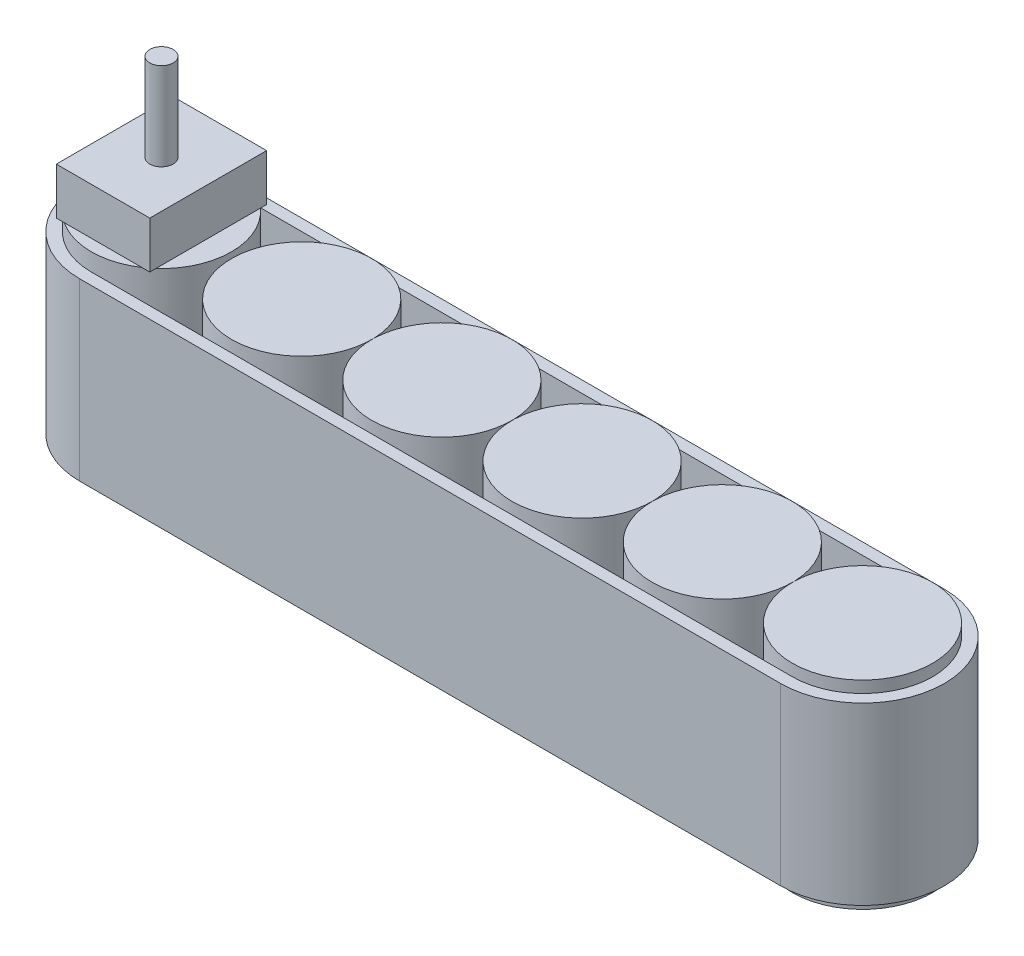
ISO-10303-21;
HEADER;
FILE_DESCRIPTION(('STEP AP214'),'2;1');
FILE_NAME('part.step','',(''),(''),'','','');
FILE_SCHEMA(('AUTOMOTIVE_DESIGN { 1 0 10303 214 1 1 1 1 }'));
ENDSEC;
DATA;
#1=APPLICATION_CONTEXT('core data for automotive mechanical design processes');
#2=APPLICATION_PROTOCOL_DEFINITION('international standard','automotive_design',2000,#1);
#3=PRODUCT_CONTEXT('',#1,'mechanical');
#4=PRODUCT('Part','Part','',(#3));
#5=PRODUCT_RELATED_PRODUCT_CATEGORY('part','',(#4));
#6=PRODUCT_DEFINITION_FORMATION('','',#4);
#7=PRODUCT_DEFINITION_CONTEXT('part definition',#1,'design');
#8=PRODUCT_DEFINITION('design','',#6,#7);
#9=PRODUCT_DEFINITION_SHAPE('','',#8);
#10=(LENGTH_UNIT() NAMED_UNIT(*) SI_UNIT(.MILLI.,.METRE.));
#11=(NAMED_UNIT(*) PLANE_ANGLE_UNIT() SI_UNIT($,.RADIAN.));
#12=(NAMED_UNIT(*) SI_UNIT($,.STERADIAN.) SOLID_ANGLE_UNIT());
#13=UNCERTAINTY_MEASURE_WITH_UNIT(LENGTH_MEASURE(1.E-05),#10,'distance_accuracy_value','');
#14=(GEOMETRIC_REPRESENTATION_CONTEXT(3) GLOBAL_UNCERTAINTY_ASSIGNED_CONTEXT((#13)) GLOBAL_UNIT_ASSIGNED_CONTEXT((#10,
#11,#12)) REPRESENTATION_CONTEXT('',''));
#15=CARTESIAN_POINT('',(0.,0.,0.));
#16=DIRECTION('',(0.,0.,1.));
#17=DIRECTION('',(1.,0.,0.));
#18=AXIS2_PLACEMENT_3D('',#15,#16,#17);
#19=CARTESIAN_POINT('',(480.,85.,0.));
#20=DIRECTION('',(0.,-1.,0.));
#21=DIRECTION('',(0.,0.,-1.));
#22=AXIS2_PLACEMENT_3D('',#19,#20,#21);
#23=CYLINDRICAL_SURFACE('',#22,60.0000000000001);
#24=CARTESIAN_POINT('',(480.,85.,0.));
#25=DIRECTION('',(0.,1.,0.));
#26=DIRECTION('',(0.,0.,1.));
#27=AXIS2_PLACEMENT_3D('',#24,#25,#26);
#28=CIRCLE('',#27,60.0000000000001);
#29=CARTESIAN_POINT('',(480.,85.,60.0000000000001));
#30=VERTEX_POINT('',#29);
#31=EDGE_CURVE('E12',#30,#30,#28,.T.);
#32=ORIENTED_EDGE('',*,*,#31,.F.);
#33=EDGE_LOOP('',(#32));
#34=FACE_BOUND('',#33,.T.);
#35=CARTESIAN_POINT('',(480.,-85.,0.));
#36=DIRECTION('',(0.,1.,0.));
#37=DIRECTION('',(0.,0.,1.));
#38=AXIS2_PLACEMENT_3D('',#35,#36,#37);
#39=CIRCLE('',#38,60.0000000000001);
#40=CARTESIAN_POINT('',(480.,-85.,60.0000000000001));
#41=VERTEX_POINT('',#40);
#42=EDGE_CURVE('E74',#41,#41,#39,.T.);
#43=ORIENTED_EDGE('',*,*,#42,.T.);
#44=EDGE_LOOP('',(#43));
#45=FACE_BOUND('',#44,.T.);
#46=ADVANCED_FACE('F71',(#34,#45),#23,.T.);
#47=CARTESIAN_POINT('',(0.,85.,0.));
#48=DIRECTION('',(0.,1.,0.));
#49=DIRECTION('',(0.,0.,1.));
#50=AXIS2_PLACEMENT_3D('',#47,#48,#49);
#51=PLANE('',#50);
#52=ORIENTED_EDGE('',*,*,#31,.T.);
#53=EDGE_LOOP('',(#52));
#54=FACE_BOUND('',#53,.T.);
#55=ADVANCED_FACE('F86',(#54),#51,.T.);
#56=CARTESIAN_POINT('',(0.,-85.,0.));
#57=DIRECTION('',(0.,1.,0.));
#58=DIRECTION('',(0.,0.,1.));
#59=AXIS2_PLACEMENT_3D('',#56,#57,#58);
#60=PLANE('',#59);
#61=ORIENTED_EDGE('',*,*,#42,.F.);
#62=EDGE_LOOP('',(#61));
#63=FACE_BOUND('',#62,.T.);
#64=ADVANCED_FACE('F84',(#63),#60,.F.);
#65=CLOSED_SHELL('',(#46,#55,#64));
#66=MANIFOLD_SOLID_BREP('B2',#65);
#67=CARTESIAN_POINT('',(360.,85.,0.));
#68=DIRECTION('',(0.,-1.,0.));
#69=DIRECTION('',(0.,0.,-1.));
#70=AXIS2_PLACEMENT_3D('',#67,#68,#69);
#71=CYLINDRICAL_SURFACE('',#70,60.);
#72=CARTESIAN_POINT('',(360.,85.,0.));
#73=DIRECTION('',(0.,1.,0.));
#74=DIRECTION('',(0.,0.,1.));
#75=AXIS2_PLACEMENT_3D('',#72,#73,#74);
#76=CIRCLE('',#75,60.);
#77=CARTESIAN_POINT('',(360.,85.,60.));
#78=VERTEX_POINT('',#77);
#79=EDGE_CURVE('E70',#78,#78,#76,.T.);
#80=ORIENTED_EDGE('',*,*,#79,.F.);
#81=EDGE_LOOP('',(#80));
#82=FACE_BOUND('',#81,.T.);
#83=CARTESIAN_POINT('',(360.,-85.,0.));
#84=DIRECTION('',(0.,1.,0.));
#85=DIRECTION('',(0.,0.,1.));
#86=AXIS2_PLACEMENT_3D('',#83,#84,#85);
#87=CIRCLE('',#86,60.);
#88=CARTESIAN_POINT('',(360.,-85.,60.));
#89=VERTEX_POINT('',#88);
#90=EDGE_CURVE('E122',#89,#89,#87,.T.);
#91=ORIENTED_EDGE('',*,*,#90,.T.);
#92=EDGE_LOOP('',(#91));
#93=FACE_BOUND('',#92,.T.);
#94=ADVANCED_FACE('F119',(#82,#93),#71,.T.);
#95=CARTESIAN_POINT('',(0.,85.,0.));
#96=DIRECTION('',(0.,1.,0.));
#97=DIRECTION('',(0.,0.,1.));
#98=AXIS2_PLACEMENT_3D('',#95,#96,#97);
#99=PLANE('',#98);
#100=ORIENTED_EDGE('',*,*,#79,.T.);
#101=EDGE_LOOP('',(#100));
#102=FACE_BOUND('',#101,.T.);
#103=ADVANCED_FACE('F134',(#102),#99,.T.);
#104=CARTESIAN_POINT('',(0.,-85.,0.));
#105=DIRECTION('',(0.,1.,0.));
#106=DIRECTION('',(0.,0.,1.));
#107=AXIS2_PLACEMENT_3D('',#104,#105,#106);
#108=PLANE('',#107);
#109=ORIENTED_EDGE('',*,*,#90,.F.);
#110=EDGE_LOOP('',(#109));
#111=FACE_BOUND('',#110,.T.);
#112=ADVANCED_FACE('F132',(#111),#108,.F.);
#113=CLOSED_SHELL('',(#94,#103,#112));
#114=MANIFOLD_SOLID_BREP('B7',#113);
#115=CARTESIAN_POINT('',(240.,85.,0.));
#116=DIRECTION('',(0.,-1.,0.));
#117=DIRECTION('',(0.,0.,-1.));
#118=AXIS2_PLACEMENT_3D('',#115,#116,#117);
#119=CYLINDRICAL_SURFACE('',#118,60.);
#120=CARTESIAN_POINT('',(240.,85.,0.));
#121=DIRECTION('',(0.,1.,0.));
#122=DIRECTION('',(0.,0.,1.));
#123=AXIS2_PLACEMENT_3D('',#120,#121,#122);
#124=CIRCLE('',#123,60.);
#125=CARTESIAN_POINT('',(240.,85.,60.));
#126=VERTEX_POINT('',#125);
#127=EDGE_CURVE('E118',#126,#126,#124,.T.);
#128=ORIENTED_EDGE('',*,*,#127,.F.);
#129=EDGE_LOOP('',(#128));
#130=FACE_BOUND('',#129,.T.);
#131=CARTESIAN_POINT('',(240.,-85.,0.));
#132=DIRECTION('',(0.,1.,0.));
#133=DIRECTION('',(0.,0.,1.));
#134=AXIS2_PLACEMENT_3D('',#131,#132,#133);
#135=CIRCLE('',#134,60.);
#136=CARTESIAN_POINT('',(240.,-85.,60.));
#137=VERTEX_POINT('',#136);
#138=EDGE_CURVE('E170',#137,#137,#135,.T.);
#139=ORIENTED_EDGE('',*,*,#138,.T.);
#140=EDGE_LOOP('',(#139));
#141=FACE_BOUND('',#140,.T.);
#142=ADVANCED_FACE('F167',(#130,#141),#119,.T.);
#143=CARTESIAN_POINT('',(0.,85.,0.));
#144=DIRECTION('',(0.,1.,0.));
#145=DIRECTION('',(0.,0.,1.));
#146=AXIS2_PLACEMENT_3D('',#143,#144,#145);
#147=PLANE('',#146);
#148=ORIENTED_EDGE('',*,*,#127,.T.);
#149=EDGE_LOOP('',(#148));
#150=FACE_BOUND('',#149,.T.);
#151=ADVANCED_FACE('F182',(#150),#147,.T.);
#152=CARTESIAN_POINT('',(0.,-85.,0.));
#153=DIRECTION('',(0.,1.,0.));
#154=DIRECTION('',(0.,0.,1.));
#155=AXIS2_PLACEMENT_3D('',#152,#153,#154);
#156=PLANE('',#155);
#157=ORIENTED_EDGE('',*,*,#138,.F.);
#158=EDGE_LOOP('',(#157));
#159=FACE_BOUND('',#158,.T.);
#160=ADVANCED_FACE('F180',(#159),#156,.F.);
#161=CLOSED_SHELL('',(#142,#151,#160));
#162=MANIFOLD_SOLID_BREP('B65',#161);
#163=CARTESIAN_POINT('',(120.,85.,0.));
#164=DIRECTION('',(0.,-1.,0.));
#165=DIRECTION('',(0.,0.,-1.));
#166=AXIS2_PLACEMENT_3D('',#163,#164,#165);
#167=CYLINDRICAL_SURFACE('',#166,60.);
#168=CARTESIAN_POINT('',(120.,85.,0.));
#169=DIRECTION('',(0.,1.,0.));
#170=DIRECTION('',(0.,0.,1.));
#171=AXIS2_PLACEMENT_3D('',#168,#169,#170);
#172=CIRCLE('',#171,60.);
#173=CARTESIAN_POINT('',(120.,85.,60.));
#174=VERTEX_POINT('',#173);
#175=EDGE_CURVE('E166',#174,#174,#172,.T.);
#176=ORIENTED_EDGE('',*,*,#175,.F.);
#177=EDGE_LOOP('',(#176));
#178=FACE_BOUND('',#177,.T.);
#179=CARTESIAN_POINT('',(120.,-85.,0.));
#180=DIRECTION('',(0.,1.,0.));
#181=DIRECTION('',(0.,0.,1.));
#182=AXIS2_PLACEMENT_3D('',#179,#180,#181);
#183=CIRCLE('',#182,60.);
#184=CARTESIAN_POINT('',(120.,-85.,60.));
#185=VERTEX_POINT('',#184);
#186=EDGE_CURVE('E219',#185,#185,#183,.T.);
#187=ORIENTED_EDGE('',*,*,#186,.T.);
#188=EDGE_LOOP('',(#187));
#189=FACE_BOUND('',#188,.T.);
#190=ADVANCED_FACE('F216',(#178,#189),#167,.T.);
#191=CARTESIAN_POINT('',(0.,85.,0.));
#192=DIRECTION('',(0.,1.,0.));
#193=DIRECTION('',(0.,0.,1.));
#194=AXIS2_PLACEMENT_3D('',#191,#192,#193);
#195=PLANE('',#194);
#196=ORIENTED_EDGE('',*,*,#175,.T.);
#197=EDGE_LOOP('',(#196));
#198=FACE_BOUND('',#197,.T.);
#199=ADVANCED_FACE('F231',(#198),#195,.T.);
#200=CARTESIAN_POINT('',(0.,-85.,0.));
#201=DIRECTION('',(0.,1.,0.));
#202=DIRECTION('',(0.,0.,1.));
#203=AXIS2_PLACEMENT_3D('',#200,#201,#202);
#204=PLANE('',#203);
#205=ORIENTED_EDGE('',*,*,#186,.F.);
#206=EDGE_LOOP('',(#205));
#207=FACE_BOUND('',#206,.T.);
#208=ADVANCED_FACE('F229',(#207),#204,.F.);
#209=CLOSED_SHELL('',(#190,#199,#208));
#210=MANIFOLD_SOLID_BREP('B113',#209);
#211=CARTESIAN_POINT('',(0.,90.,0.));
#212=DIRECTION('',(0.,1.,0.));
#213=DIRECTION('',(0.,0.,1.));
#214=AXIS2_PLACEMENT_3D('',#211,#212,#213);
#215=PLANE('',#214);
#216=CARTESIAN_POINT('',(0.,90.,0.));
#217=DIRECTION('',(0.,1.,0.));
#218=DIRECTION('',(0.,0.,1.));
#219=AXIS2_PLACEMENT_3D('',#216,#217,#218);
#220=CIRCLE('',#219,60.);
#221=CARTESIAN_POINT('',(40.,90.,44.7213595499958));
#222=VERTEX_POINT('',#221);
#223=CARTESIAN_POINT('',(40.,90.,-44.7213595499958));
#224=VERTEX_POINT('',#223);
#225=EDGE_CURVE('E413',#222,#224,#220,.T.);
#226=ORIENTED_EDGE('',*,*,#225,.T.);
#227=DIRECTION('',(0.,0.,-1.));
#228=VECTOR('',#227,1.);
#229=CARTESIAN_POINT('',(40.,90.,-50.));
#230=LINE('',#229,#228);
#231=EDGE_CURVE('E566',#222,#224,#230,.T.);
#232=ORIENTED_EDGE('',*,*,#231,.F.);
#233=EDGE_LOOP('',(#226,#232));
#234=FACE_BOUND('',#233,.T.);
#235=ADVANCED_FACE('F257',(#234),#215,.T.);
#236=CARTESIAN_POINT('',(33.166247903554,90.,-50.));
#237=VERTEX_POINT('',#236);
#238=CARTESIAN_POINT('',(-33.166247903554,90.,-50.));
#239=VERTEX_POINT('',#238);
#240=EDGE_CURVE('E593',#237,#239,#220,.T.);
#241=ORIENTED_EDGE('',*,*,#240,.T.);
#242=DIRECTION('',(-1.,0.,0.));
#243=VECTOR('',#242,1.);
#244=CARTESIAN_POINT('',(-40.,90.,-50.));
#245=LINE('',#244,#243);
#246=EDGE_CURVE('E577',#237,#239,#245,.T.);
#247=ORIENTED_EDGE('',*,*,#246,.F.);
#248=EDGE_LOOP('',(#241,#247));
#249=FACE_BOUND('',#248,.T.);
#250=ADVANCED_FACE('F532',(#249),#215,.T.);
#251=CARTESIAN_POINT('',(-40.,90.,-44.7213595499958));
#252=VERTEX_POINT('',#251);
#253=CARTESIAN_POINT('',(-40.,90.,44.7213595499958));
#254=VERTEX_POINT('',#253);
#255=EDGE_CURVE('E557',#252,#254,#220,.T.);
#256=ORIENTED_EDGE('',*,*,#255,.T.);
#257=DIRECTION('',(0.,0.,1.));
#258=VECTOR('',#257,1.);
#259=CARTESIAN_POINT('',(-40.,90.,-50.));
#260=LINE('',#259,#258);
#261=EDGE_CURVE('E581',#252,#254,#260,.T.);
#262=ORIENTED_EDGE('',*,*,#261,.F.);
#263=EDGE_LOOP('',(#256,#262));
#264=FACE_BOUND('',#263,.T.);
#265=ADVANCED_FACE('F539',(#264),#215,.T.);
#266=CARTESIAN_POINT('',(-33.166247903554,90.,50.));
#267=VERTEX_POINT('',#266);
#268=CARTESIAN_POINT('',(33.166247903554,90.,50.));
#269=VERTEX_POINT('',#268);
#270=EDGE_CURVE('E414',#267,#269,#220,.T.);
#271=ORIENTED_EDGE('',*,*,#270,.T.);
#272=DIRECTION('',(1.,0.,0.));
#273=VECTOR('',#272,1.);
#274=CARTESIAN_POINT('',(-40.,90.,50.));
#275=LINE('',#274,#273);
#276=EDGE_CURVE('E555',#267,#269,#275,.T.);
#277=ORIENTED_EDGE('',*,*,#276,.F.);
#278=EDGE_LOOP('',(#271,#277));
#279=FACE_BOUND('',#278,.T.);
#280=ADVANCED_FACE('F506',(#279),#215,.T.);
#281=CARTESIAN_POINT('',(0.,75.,0.));
#282=DIRECTION('',(0.,1.,0.));
#283=DIRECTION('',(0.,0.,1.));
#284=AXIS2_PLACEMENT_3D('',#281,#282,#283);
#285=PLANE('',#284);
#286=CARTESIAN_POINT('',(0.,75.,0.));
#287=DIRECTION('',(0.,1.,0.));
#288=DIRECTION('',(0.,0.,1.));
#289=AXIS2_PLACEMENT_3D('',#286,#287,#288);
#290=CIRCLE('',#289,70.);
#291=CARTESIAN_POINT('',(0.,75.,-70.));
#292=VERTEX_POINT('',#291);
#293=CARTESIAN_POINT('',(0.,75.,70.));
#294=VERTEX_POINT('',#293);
#295=EDGE_CURVE('E457',#292,#294,#290,.T.);
#296=ORIENTED_EDGE('',*,*,#295,.T.);
#297=DIRECTION('',(1.,0.,0.));
#298=VECTOR('',#297,1.);
#299=CARTESIAN_POINT('',(0.,75.,70.));
#300=LINE('',#299,#298);
#301=CARTESIAN_POINT('',(600.,75.,70.));
#302=VERTEX_POINT('',#301);
#303=EDGE_CURVE('E460',#294,#302,#300,.T.);
#304=ORIENTED_EDGE('',*,*,#303,.T.);
#305=CARTESIAN_POINT('',(600.,75.,0.));
#306=DIRECTION('',(0.,1.,0.));
#307=DIRECTION('',(0.,0.,1.));
#308=AXIS2_PLACEMENT_3D('',#305,#306,#307);
#309=CIRCLE('',#308,70.);
#310=CARTESIAN_POINT('',(600.,75.,-70.));
#311=VERTEX_POINT('',#310);
#312=EDGE_CURVE('E463',#302,#311,#309,.T.);
#313=ORIENTED_EDGE('',*,*,#312,.T.);
#314=DIRECTION('',(-1.,0.,0.));
#315=VECTOR('',#314,1.);
#316=CARTESIAN_POINT('',(0.,75.,-70.));
#317=LINE('',#316,#315);
#318=EDGE_CURVE('E465',#311,#292,#317,.T.);
#319=ORIENTED_EDGE('',*,*,#318,.T.);
#320=EDGE_LOOP('',(#296,#304,#313,#319));
#321=FACE_BOUND('',#320,.T.);
#322=DIRECTION('',(1.,0.,0.));
#323=VECTOR('',#322,1.);
#324=CARTESIAN_POINT('',(0.,75.,60.));
#325=LINE('',#324,#323);
#326=CARTESIAN_POINT('',(0.,75.,60.));
#327=VERTEX_POINT('',#326);
#328=CARTESIAN_POINT('',(600.,75.,60.));
#329=VERTEX_POINT('',#328);
#330=EDGE_CURVE('E432',#327,#329,#325,.T.);
#331=ORIENTED_EDGE('',*,*,#330,.F.);
#332=CARTESIAN_POINT('',(0.,75.,0.));
#333=DIRECTION('',(0.,1.,0.));
#334=DIRECTION('',(0.,0.,1.));
#335=AXIS2_PLACEMENT_3D('',#332,#333,#334);
#336=CIRCLE('',#335,60.);
#337=CARTESIAN_POINT('',(0.,75.,-60.));
#338=VERTEX_POINT('',#337);
#339=EDGE_CURVE('E430',#338,#327,#336,.T.);
#340=ORIENTED_EDGE('',*,*,#339,.F.);
#341=DIRECTION('',(-1.,0.,0.));
#342=VECTOR('',#341,1.);
#343=CARTESIAN_POINT('',(0.,75.,-60.));
#344=LINE('',#343,#342);
#345=CARTESIAN_POINT('',(600.,75.,-60.));
#346=VERTEX_POINT('',#345);
#347=EDGE_CURVE('E438',#346,#338,#344,.T.);
#348=ORIENTED_EDGE('',*,*,#347,.F.);
#349=CARTESIAN_POINT('',(600.,75.,0.));
#350=DIRECTION('',(0.,1.,0.));
#351=DIRECTION('',(0.,0.,1.));
#352=AXIS2_PLACEMENT_3D('',#349,#350,#351);
#353=CIRCLE('',#352,60.);
#354=EDGE_CURVE('E435',#329,#346,#353,.T.);
#355=ORIENTED_EDGE('',*,*,#354,.F.);
#356=EDGE_LOOP('',(#331,#340,#348,#355));
#357=FACE_BOUND('',#356,.T.);
#358=ADVANCED_FACE('F503',(#321,#357),#285,.T.);
#359=CARTESIAN_POINT('',(0.,-75.,0.));
#360=DIRECTION('',(0.,1.,0.));
#361=DIRECTION('',(0.,0.,1.));
#362=AXIS2_PLACEMENT_3D('',#359,#360,#361);
#363=PLANE('',#362);
#364=CARTESIAN_POINT('',(0.,-75.,0.));
#365=DIRECTION('',(0.,1.,0.));
#366=DIRECTION('',(0.,0.,1.));
#367=AXIS2_PLACEMENT_3D('',#364,#365,#366);
#368=CIRCLE('',#367,70.);
#369=CARTESIAN_POINT('',(0.,-75.,-70.));
#370=VERTEX_POINT('',#369);
#371=CARTESIAN_POINT('',(0.,-75.,70.));
#372=VERTEX_POINT('',#371);
#373=EDGE_CURVE('E456',#370,#372,#368,.T.);
#374=ORIENTED_EDGE('',*,*,#373,.F.);
#375=DIRECTION('',(-1.,0.,0.));
#376=VECTOR('',#375,1.);
#377=CARTESIAN_POINT('',(0.,-75.,-70.));
#378=LINE('',#377,#376);
#379=CARTESIAN_POINT('',(600.,-75.,-70.));
#380=VERTEX_POINT('',#379);
#381=EDGE_CURVE('E461',#380,#370,#378,.T.);
#382=ORIENTED_EDGE('',*,*,#381,.F.);
#383=CARTESIAN_POINT('',(600.,-75.,0.));
#384=DIRECTION('',(0.,1.,0.));
#385=DIRECTION('',(0.,0.,1.));
#386=AXIS2_PLACEMENT_3D('',#383,#384,#385);
#387=CIRCLE('',#386,70.);
#388=CARTESIAN_POINT('',(600.,-75.,70.));
#389=VERTEX_POINT('',#388);
#390=EDGE_CURVE('E472',#389,#380,#387,.T.);
#391=ORIENTED_EDGE('',*,*,#390,.F.);
#392=DIRECTION('',(1.,0.,0.));
#393=VECTOR('',#392,1.);
#394=CARTESIAN_POINT('',(0.,-75.,70.));
#395=LINE('',#394,#393);
#396=EDGE_CURVE('E470',#372,#389,#395,.T.);
#397=ORIENTED_EDGE('',*,*,#396,.F.);
#398=EDGE_LOOP('',(#374,#382,#391,#397));
#399=FACE_BOUND('',#398,.T.);
#400=CARTESIAN_POINT('',(0.,-75.,0.));
#401=DIRECTION('',(0.,1.,0.));
#402=DIRECTION('',(0.,0.,1.));
#403=AXIS2_PLACEMENT_3D('',#400,#401,#402);
#404=CIRCLE('',#403,60.);
#405=CARTESIAN_POINT('',(0.,-75.,-60.));
#406=VERTEX_POINT('',#405);
#407=CARTESIAN_POINT('',(0.,-75.,60.));
#408=VERTEX_POINT('',#407);
#409=EDGE_CURVE('E429',#406,#408,#404,.T.);
#410=ORIENTED_EDGE('',*,*,#409,.T.);
#411=DIRECTION('',(1.,0.,0.));
#412=VECTOR('',#411,1.);
#413=CARTESIAN_POINT('',(0.,-75.,60.));
#414=LINE('',#413,#412);
#415=CARTESIAN_POINT('',(600.,-75.,60.));
#416=VERTEX_POINT('',#415);
#417=EDGE_CURVE('E443',#408,#416,#414,.T.);
#418=ORIENTED_EDGE('',*,*,#417,.T.);
#419=CARTESIAN_POINT('',(600.,-75.,0.));
#420=DIRECTION('',(0.,1.,0.));
#421=DIRECTION('',(0.,0.,1.));
#422=AXIS2_PLACEMENT_3D('',#419,#420,#421);
#423=CIRCLE('',#422,60.);
#424=CARTESIAN_POINT('',(600.,-75.,-60.0000000000001));
#425=VERTEX_POINT('',#424);
#426=EDGE_CURVE('E445',#416,#425,#423,.T.);
#427=ORIENTED_EDGE('',*,*,#426,.T.);
#428=DIRECTION('',(-1.,0.,0.));
#429=VECTOR('',#428,1.);
#430=CARTESIAN_POINT('',(0.,-75.,-60.));
#431=LINE('',#430,#429);
#432=EDGE_CURVE('E433',#425,#406,#431,.T.);
#433=ORIENTED_EDGE('',*,*,#432,.T.);
#434=EDGE_LOOP('',(#410,#418,#427,#433));
#435=FACE_BOUND('',#434,.T.);
#436=ADVANCED_FACE('F495',(#399,#435),#363,.F.);
#437=CARTESIAN_POINT('',(0.,75.,0.));
#438=DIRECTION('',(0.,-1.,0.));
#439=DIRECTION('',(0.,0.,-1.));
#440=AXIS2_PLACEMENT_3D('',#437,#438,#439);
#441=CYLINDRICAL_SURFACE('',#440,70.);
#442=ORIENTED_EDGE('',*,*,#373,.T.);
#443=DIRECTION('',(0.,-1.,0.));
#444=VECTOR('',#443,1.);
#445=CARTESIAN_POINT('',(0.,75.,70.));
#446=LINE('',#445,#444);
#447=EDGE_CURVE('E261',#294,#372,#446,.T.);
#448=ORIENTED_EDGE('',*,*,#447,.F.);
#449=ORIENTED_EDGE('',*,*,#295,.F.);
#450=DIRECTION('',(0.,-1.,0.));
#451=VECTOR('',#450,1.);
#452=CARTESIAN_POINT('',(0.,75.,-70.));
#453=LINE('',#452,#451);
#454=EDGE_CURVE('E467',#292,#370,#453,.T.);
#455=ORIENTED_EDGE('',*,*,#454,.T.);
#456=EDGE_LOOP('',(#442,#448,#449,#455));
#457=FACE_BOUND('',#456,.T.);
#458=ADVANCED_FACE('F259',(#457),#441,.T.);
#459=CARTESIAN_POINT('',(0.,75.,70.));
#460=DIRECTION('',(0.,0.,-1.));
#461=DIRECTION('',(-1.,0.,0.));
#462=AXIS2_PLACEMENT_3D('',#459,#460,#461);
#463=PLANE('',#462);
#464=ORIENTED_EDGE('',*,*,#396,.T.);
#465=DIRECTION('',(0.,-1.,0.));
#466=VECTOR('',#465,1.);
#467=CARTESIAN_POINT('',(600.,75.,70.));
#468=LINE('',#467,#466);
#469=EDGE_CURVE('E479',#302,#389,#468,.T.);
#470=ORIENTED_EDGE('',*,*,#469,.F.);
#471=ORIENTED_EDGE('',*,*,#303,.F.);
#472=ORIENTED_EDGE('',*,*,#447,.T.);
#473=EDGE_LOOP('',(#464,#470,#471,#472));
#474=FACE_BOUND('',#473,.T.);
#475=ADVANCED_FACE('F488',(#474),#463,.F.);
#476=CARTESIAN_POINT('',(600.,75.,0.));
#477=DIRECTION('',(0.,-1.,0.));
#478=DIRECTION('',(0.,0.,-1.));
#479=AXIS2_PLACEMENT_3D('',#476,#477,#478);
#480=CYLINDRICAL_SURFACE('',#479,70.);
#481=ORIENTED_EDGE('',*,*,#390,.T.);
#482=DIRECTION('',(0.,-1.,0.));
#483=VECTOR('',#482,1.);
#484=CARTESIAN_POINT('',(600.,75.,-70.));
#485=LINE('',#484,#483);
#486=EDGE_CURVE('E477',#311,#380,#485,.T.);
#487=ORIENTED_EDGE('',*,*,#486,.F.);
#488=ORIENTED_EDGE('',*,*,#312,.F.);
#489=ORIENTED_EDGE('',*,*,#469,.T.);
#490=EDGE_LOOP('',(#481,#487,#488,#489));
#491=FACE_BOUND('',#490,.T.);
#492=ADVANCED_FACE('F498',(#491),#480,.T.);
#493=CARTESIAN_POINT('',(0.,75.,-70.));
#494=DIRECTION('',(0.,0.,1.));
#495=DIRECTION('',(1.,0.,0.));
#496=AXIS2_PLACEMENT_3D('',#493,#494,#495);
#497=PLANE('',#496);
#498=ORIENTED_EDGE('',*,*,#381,.T.);
#499=ORIENTED_EDGE('',*,*,#454,.F.);
#500=ORIENTED_EDGE('',*,*,#318,.F.);
#501=ORIENTED_EDGE('',*,*,#486,.T.);
#502=EDGE_LOOP('',(#498,#499,#500,#501));
#503=FACE_BOUND('',#502,.T.);
#504=ADVANCED_FACE('F501',(#503),#497,.F.);
#505=CARTESIAN_POINT('',(0.,75.,60.));
#506=DIRECTION('',(0.,0.,-1.));
#507=DIRECTION('',(-1.,0.,0.));
#508=AXIS2_PLACEMENT_3D('',#505,#506,#507);
#509=PLANE('',#508);
#510=ORIENTED_EDGE('',*,*,#330,.T.);
#511=DIRECTION('',(0.,-1.,0.));
#512=VECTOR('',#511,1.);
#513=CARTESIAN_POINT('',(600.,75.,60.));
#514=LINE('',#513,#512);
#515=EDGE_CURVE('E451',#329,#416,#514,.T.);
#516=ORIENTED_EDGE('',*,*,#515,.T.);
#517=ORIENTED_EDGE('',*,*,#417,.F.);
#518=DIRECTION('',(0.,-1.,0.));
#519=VECTOR('',#518,1.);
#520=CARTESIAN_POINT('',(0.,75.,60.));
#521=LINE('',#520,#519);
#522=EDGE_CURVE('E454',#327,#408,#521,.T.);
#523=ORIENTED_EDGE('',*,*,#522,.F.);
#524=EDGE_LOOP('',(#510,#516,#517,#523));
#525=FACE_BOUND('',#524,.T.);
#526=ADVANCED_FACE('F514',(#525),#509,.T.);
#527=CARTESIAN_POINT('',(0.,75.,-60.));
#528=DIRECTION('',(0.,0.,1.));
#529=DIRECTION('',(1.,0.,0.));
#530=AXIS2_PLACEMENT_3D('',#527,#528,#529);
#531=PLANE('',#530);
#532=ORIENTED_EDGE('',*,*,#347,.T.);
#533=DIRECTION('',(0.,-1.,0.));
#534=VECTOR('',#533,1.);
#535=CARTESIAN_POINT('',(0.,75.,-60.));
#536=LINE('',#535,#534);
#537=EDGE_CURVE('E440',#338,#406,#536,.T.);
#538=ORIENTED_EDGE('',*,*,#537,.T.);
#539=ORIENTED_EDGE('',*,*,#432,.F.);
#540=DIRECTION('',(0.,-1.,0.));
#541=VECTOR('',#540,1.);
#542=CARTESIAN_POINT('',(600.,75.,-60.));
#543=LINE('',#542,#541);
#544=EDGE_CURVE('E281',#346,#425,#543,.T.);
#545=ORIENTED_EDGE('',*,*,#544,.F.);
#546=EDGE_LOOP('',(#532,#538,#539,#545));
#547=FACE_BOUND('',#546,.T.);
#548=ADVANCED_FACE('F522',(#547),#531,.T.);
#549=CARTESIAN_POINT('',(0.,85.,0.));
#550=DIRECTION('',(0.,-1.,0.));
#551=DIRECTION('',(0.,0.,-1.));
#552=AXIS2_PLACEMENT_3D('',#549,#550,#551);
#553=CYLINDRICAL_SURFACE('',#552,60.);
#554=CARTESIAN_POINT('',(0.,-85.,0.));
#555=DIRECTION('',(0.,1.,0.));
#556=DIRECTION('',(0.,0.,1.));
#557=AXIS2_PLACEMENT_3D('',#554,#555,#556);
#558=CIRCLE('',#557,60.);
#559=CARTESIAN_POINT('',(0.,-85.,60.));
#560=VERTEX_POINT('',#559);
#561=EDGE_CURVE('E424',#560,#560,#558,.T.);
#562=ORIENTED_EDGE('',*,*,#561,.T.);
#563=EDGE_LOOP('',(#562));
#564=FACE_BOUND('',#563,.T.);
#565=ORIENTED_EDGE('',*,*,#522,.T.);
#566=ORIENTED_EDGE('',*,*,#409,.F.);
#567=ORIENTED_EDGE('',*,*,#537,.F.);
#568=ORIENTED_EDGE('',*,*,#339,.T.);
#569=EDGE_LOOP('',(#565,#566,#567,#568));
#570=FACE_BOUND('',#569,.T.);
#571=EDGE_CURVE('E410',#269,#222,#220,.T.);
#572=ORIENTED_EDGE('',*,*,#571,.F.);
#573=ORIENTED_EDGE('',*,*,#270,.F.);
#574=CARTESIAN_POINT('',(0.,90.,0.));
#575=DIRECTION('',(0.,1.,0.));
#576=DIRECTION('',(0.,0.,1.));
#577=AXIS2_PLACEMENT_3D('',#574,#575,#576);
#578=CIRCLE('',#577,60.);
#579=EDGE_CURVE('E401',#254,#267,#578,.T.);
#580=ORIENTED_EDGE('',*,*,#579,.F.);
#581=ORIENTED_EDGE('',*,*,#255,.F.);
#582=EDGE_CURVE('E403',#239,#252,#578,.T.);
#583=ORIENTED_EDGE('',*,*,#582,.F.);
#584=ORIENTED_EDGE('',*,*,#240,.F.);
#585=EDGE_CURVE('E405',#224,#237,#578,.T.);
#586=ORIENTED_EDGE('',*,*,#585,.F.);
#587=ORIENTED_EDGE('',*,*,#225,.F.);
#588=EDGE_LOOP('',(#572,#573,#580,#581,#583,#584,#586,#587));
#589=FACE_BOUND('',#588,.T.);
#590=ADVANCED_FACE('F519',(#564,#570,#589),#553,.T.);
#591=CARTESIAN_POINT('',(0.,-85.,0.));
#592=DIRECTION('',(0.,1.,0.));
#593=DIRECTION('',(0.,0.,1.));
#594=AXIS2_PLACEMENT_3D('',#591,#592,#593);
#595=PLANE('',#594);
#596=CARTESIAN_POINT('',(0.,-85.,0.));
#597=DIRECTION('',(0.,-1.,0.));
#598=DIRECTION('',(0.,0.,-1.));
#599=AXIS2_PLACEMENT_3D('',#596,#597,#598);
#600=CIRCLE('',#599,12.5);
#601=CARTESIAN_POINT('',(0.,-85.,-12.5));
#602=VERTEX_POINT('',#601);
#603=EDGE_CURVE('E214',#602,#602,#600,.T.);
#604=ORIENTED_EDGE('',*,*,#603,.F.);
#605=EDGE_LOOP('',(#604));
#606=FACE_BOUND('',#605,.T.);
#607=ORIENTED_EDGE('',*,*,#561,.F.);
#608=EDGE_LOOP('',(#607));
#609=FACE_BOUND('',#608,.T.);
#610=ADVANCED_FACE('F654',(#606,#609),#595,.F.);
#611=CARTESIAN_POINT('',(600.,85.,0.));
#612=DIRECTION('',(0.,-1.,0.));
#613=DIRECTION('',(0.,0.,-1.));
#614=AXIS2_PLACEMENT_3D('',#611,#612,#613);
#615=CYLINDRICAL_SURFACE('',#614,60.0000000000001);
#616=CARTESIAN_POINT('',(600.,-85.,0.));
#617=DIRECTION('',(0.,1.,0.));
#618=DIRECTION('',(0.,0.,1.));
#619=AXIS2_PLACEMENT_3D('',#616,#617,#618);
#620=CIRCLE('',#619,60.0000000000001);
#621=CARTESIAN_POINT('',(600.,-85.,60.0000000000001));
#622=VERTEX_POINT('',#621);
#623=EDGE_CURVE('E419',#622,#622,#620,.T.);
#624=ORIENTED_EDGE('',*,*,#623,.T.);
#625=EDGE_LOOP('',(#624));
#626=FACE_BOUND('',#625,.T.);
#627=CARTESIAN_POINT('',(600.,85.,0.));
#628=DIRECTION('',(0.,1.,0.));
#629=DIRECTION('',(0.,0.,1.));
#630=AXIS2_PLACEMENT_3D('',#627,#628,#629);
#631=CIRCLE('',#630,60.0000000000001);
#632=CARTESIAN_POINT('',(600.,85.,60.0000000000001));
#633=VERTEX_POINT('',#632);
#634=EDGE_CURVE('E421',#633,#633,#631,.T.);
#635=ORIENTED_EDGE('',*,*,#634,.F.);
#636=EDGE_LOOP('',(#635));
#637=FACE_BOUND('',#636,.T.);
#638=ORIENTED_EDGE('',*,*,#426,.F.);
#639=ORIENTED_EDGE('',*,*,#515,.F.);
#640=ORIENTED_EDGE('',*,*,#354,.T.);
#641=ORIENTED_EDGE('',*,*,#544,.T.);
#642=EDGE_LOOP('',(#638,#639,#640,#641));
#643=FACE_BOUND('',#642,.T.);
#644=ADVANCED_FACE('F524',(#626,#637,#643),#615,.T.);
#645=CARTESIAN_POINT('',(0.,85.,0.));
#646=DIRECTION('',(0.,1.,0.));
#647=DIRECTION('',(0.,0.,1.));
#648=AXIS2_PLACEMENT_3D('',#645,#646,#647);
#649=PLANE('',#648);
#650=ORIENTED_EDGE('',*,*,#634,.T.);
#651=EDGE_LOOP('',(#650));
#652=FACE_BOUND('',#651,.T.);
#653=ADVANCED_FACE('F724',(#652),#649,.T.);
#654=CARTESIAN_POINT('',(0.,-85.,0.));
#655=DIRECTION('',(0.,1.,0.));
#656=DIRECTION('',(0.,0.,1.));
#657=AXIS2_PLACEMENT_3D('',#654,#655,#656);
#658=PLANE('',#657);
#659=ORIENTED_EDGE('',*,*,#623,.F.);
#660=EDGE_LOOP('',(#659));
#661=FACE_BOUND('',#660,.T.);
#662=ADVANCED_FACE('F705',(#661),#658,.F.);
#663=CARTESIAN_POINT('',(0.,-125.,0.));
#664=DIRECTION('',(0.,1.,0.));
#665=DIRECTION('',(0.,0.,1.));
#666=AXIS2_PLACEMENT_3D('',#663,#664,#665);
#667=CYLINDRICAL_SURFACE('',#666,12.5);
#668=CARTESIAN_POINT('',(0.,-125.,0.));
#669=DIRECTION('',(0.,-1.,0.));
#670=DIRECTION('',(0.,0.,-1.));
#671=AXIS2_PLACEMENT_3D('',#668,#669,#670);
#672=CIRCLE('',#671,12.5);
#673=CARTESIAN_POINT('',(0.,-125.,-12.5));
#674=VERTEX_POINT('',#673);
#675=EDGE_CURVE('E417',#674,#674,#672,.T.);
#676=ORIENTED_EDGE('',*,*,#675,.F.);
#677=EDGE_LOOP('',(#676));
#678=FACE_BOUND('',#677,.T.);
#679=ORIENTED_EDGE('',*,*,#603,.T.);
#680=EDGE_LOOP('',(#679));
#681=FACE_BOUND('',#680,.T.);
#682=ADVANCED_FACE('F695',(#678,#681),#667,.T.);
#683=CARTESIAN_POINT('',(0.,-125.,0.));
#684=DIRECTION('',(0.,-1.,0.));
#685=DIRECTION('',(0.,0.,-1.));
#686=AXIS2_PLACEMENT_3D('',#683,#684,#685);
#687=PLANE('',#686);
#688=ORIENTED_EDGE('',*,*,#675,.T.);
#689=EDGE_LOOP('',(#688));
#690=FACE_BOUND('',#689,.T.);
#691=ADVANCED_FACE('F613',(#690),#687,.T.);
#692=CARTESIAN_POINT('',(0.,90.,0.));
#693=DIRECTION('',(0.,1.,0.));
#694=DIRECTION('',(0.,0.,1.));
#695=AXIS2_PLACEMENT_3D('',#692,#693,#694);
#696=PLANE('',#695);
#697=CARTESIAN_POINT('',(40.,90.,50.));
#698=VERTEX_POINT('',#697);
#699=EDGE_CURVE('E564',#269,#698,#275,.T.);
#700=ORIENTED_EDGE('',*,*,#699,.F.);
#701=ORIENTED_EDGE('',*,*,#571,.T.);
#702=EDGE_CURVE('E563',#698,#222,#230,.T.);
#703=ORIENTED_EDGE('',*,*,#702,.F.);
#704=EDGE_LOOP('',(#700,#701,#703));
#705=FACE_BOUND('',#704,.T.);
#706=ADVANCED_FACE('F562',(#705),#696,.F.);
#707=CARTESIAN_POINT('',(40.,90.,-50.));
#708=VERTEX_POINT('',#707);
#709=EDGE_CURVE('E399',#224,#708,#230,.T.);
#710=ORIENTED_EDGE('',*,*,#709,.F.);
#711=ORIENTED_EDGE('',*,*,#585,.T.);
#712=EDGE_CURVE('E574',#708,#237,#245,.T.);
#713=ORIENTED_EDGE('',*,*,#712,.F.);
#714=EDGE_LOOP('',(#710,#711,#713));
#715=FACE_BOUND('',#714,.T.);
#716=ADVANCED_FACE('F601',(#715),#696,.F.);
#717=CARTESIAN_POINT('',(-40.,90.,-50.));
#718=VERTEX_POINT('',#717);
#719=EDGE_CURVE('E568',#239,#718,#245,.T.);
#720=ORIENTED_EDGE('',*,*,#719,.F.);
#721=ORIENTED_EDGE('',*,*,#582,.T.);
#722=EDGE_CURVE('E578',#718,#252,#260,.T.);
#723=ORIENTED_EDGE('',*,*,#722,.F.);
#724=EDGE_LOOP('',(#720,#721,#723));
#725=FACE_BOUND('',#724,.T.);
#726=ADVANCED_FACE('F603',(#725),#696,.F.);
#727=CARTESIAN_POINT('',(-40.,90.,50.));
#728=VERTEX_POINT('',#727);
#729=EDGE_CURVE('E576',#254,#728,#260,.T.);
#730=ORIENTED_EDGE('',*,*,#729,.F.);
#731=ORIENTED_EDGE('',*,*,#579,.T.);
#732=EDGE_CURVE('E273',#728,#267,#275,.T.);
#733=ORIENTED_EDGE('',*,*,#732,.F.);
#734=EDGE_LOOP('',(#730,#731,#733));
#735=FACE_BOUND('',#734,.T.);
#736=ADVANCED_FACE('F587',(#735),#696,.F.);
#737=CARTESIAN_POINT('',(0.,130.,0.));
#738=DIRECTION('',(0.,1.,0.));
#739=DIRECTION('',(0.,0.,1.));
#740=AXIS2_PLACEMENT_3D('',#737,#738,#739);
#741=PLANE('',#740);
#742=DIRECTION('',(0.,0.,-1.));
#743=VECTOR('',#742,1.);
#744=CARTESIAN_POINT('',(40.,130.,-50.));
#745=LINE('',#744,#743);
#746=CARTESIAN_POINT('',(40.,130.,50.));
#747=VERTEX_POINT('',#746);
#748=CARTESIAN_POINT('',(40.,130.,-50.));
#749=VERTEX_POINT('',#748);
#750=EDGE_CURVE('E385',#747,#749,#745,.T.);
#751=ORIENTED_EDGE('',*,*,#750,.T.);
#752=DIRECTION('',(-1.,0.,0.));
#753=VECTOR('',#752,1.);
#754=CARTESIAN_POINT('',(-40.,130.,-50.));
#755=LINE('',#754,#753);
#756=CARTESIAN_POINT('',(-40.,130.,-50.));
#757=VERTEX_POINT('',#756);
#758=EDGE_CURVE('E374',#749,#757,#755,.T.);
#759=ORIENTED_EDGE('',*,*,#758,.T.);
#760=DIRECTION('',(0.,0.,1.));
#761=VECTOR('',#760,1.);
#762=CARTESIAN_POINT('',(-40.,130.,-50.));
#763=LINE('',#762,#761);
#764=CARTESIAN_POINT('',(-40.,130.,50.));
#765=VERTEX_POINT('',#764);
#766=EDGE_CURVE('E384',#757,#765,#763,.T.);
#767=ORIENTED_EDGE('',*,*,#766,.T.);
#768=DIRECTION('',(1.,0.,0.));
#769=VECTOR('',#768,1.);
#770=CARTESIAN_POINT('',(-40.,130.,50.));
#771=LINE('',#770,#769);
#772=EDGE_CURVE('E391',#765,#747,#771,.T.);
#773=ORIENTED_EDGE('',*,*,#772,.T.);
#774=EDGE_LOOP('',(#751,#759,#767,#773));
#775=FACE_BOUND('',#774,.T.);
#776=CARTESIAN_POINT('',(0.,130.,0.));
#777=DIRECTION('',(0.,1.,0.));
#778=DIRECTION('',(0.,0.,1.));
#779=AXIS2_PLACEMENT_3D('',#776,#777,#778);
#780=CIRCLE('',#779,10.);
#781=CARTESIAN_POINT('',(0.,130.,10.));
#782=VERTEX_POINT('',#781);
#783=EDGE_CURVE('E570',#782,#782,#780,.T.);
#784=ORIENTED_EDGE('',*,*,#783,.F.);
#785=EDGE_LOOP('',(#784));
#786=FACE_BOUND('',#785,.T.);
#787=ADVANCED_FACE('F388',(#775,#786),#741,.T.);
#788=CARTESIAN_POINT('',(40.,130.,-50.));
#789=DIRECTION('',(-1.,0.,0.));
#790=DIRECTION('',(0.,0.,1.));
#791=AXIS2_PLACEMENT_3D('',#788,#789,#790);
#792=PLANE('',#791);
#793=ORIENTED_EDGE('',*,*,#702,.T.);
#794=ORIENTED_EDGE('',*,*,#231,.T.);
#795=ORIENTED_EDGE('',*,*,#709,.T.);
#796=DIRECTION('',(0.,-1.,0.));
#797=VECTOR('',#796,1.);
#798=CARTESIAN_POINT('',(40.,130.,-50.));
#799=LINE('',#798,#797);
#800=EDGE_CURVE('E379',#749,#708,#799,.T.);
#801=ORIENTED_EDGE('',*,*,#800,.F.);
#802=ORIENTED_EDGE('',*,*,#750,.F.);
#803=DIRECTION('',(0.,-1.,0.));
#804=VECTOR('',#803,1.);
#805=CARTESIAN_POINT('',(40.,130.,50.));
#806=LINE('',#805,#804);
#807=EDGE_CURVE('E567',#747,#698,#806,.T.);
#808=ORIENTED_EDGE('',*,*,#807,.T.);
#809=EDGE_LOOP('',(#793,#794,#795,#801,#802,#808));
#810=FACE_BOUND('',#809,.T.);
#811=ADVANCED_FACE('F397',(#810),#792,.F.);
#812=CARTESIAN_POINT('',(-40.,130.,-50.));
#813=DIRECTION('',(0.,0.,1.));
#814=DIRECTION('',(1.,0.,0.));
#815=AXIS2_PLACEMENT_3D('',#812,#813,#814);
#816=PLANE('',#815);
#817=ORIENTED_EDGE('',*,*,#712,.T.);
#818=ORIENTED_EDGE('',*,*,#246,.T.);
#819=ORIENTED_EDGE('',*,*,#719,.T.);
#820=DIRECTION('',(0.,-1.,0.));
#821=VECTOR('',#820,1.);
#822=CARTESIAN_POINT('',(-40.,130.,-50.));
#823=LINE('',#822,#821);
#824=EDGE_CURVE('E381',#757,#718,#823,.T.);
#825=ORIENTED_EDGE('',*,*,#824,.F.);
#826=ORIENTED_EDGE('',*,*,#758,.F.);
#827=ORIENTED_EDGE('',*,*,#800,.T.);
#828=EDGE_LOOP('',(#817,#818,#819,#825,#826,#827));
#829=FACE_BOUND('',#828,.T.);
#830=ADVANCED_FACE('F377',(#829),#816,.F.);
#831=CARTESIAN_POINT('',(-40.,130.,-50.));
#832=DIRECTION('',(1.,0.,0.));
#833=DIRECTION('',(0.,0.,-1.));
#834=AXIS2_PLACEMENT_3D('',#831,#832,#833);
#835=PLANE('',#834);
#836=ORIENTED_EDGE('',*,*,#722,.T.);
#837=ORIENTED_EDGE('',*,*,#261,.T.);
#838=ORIENTED_EDGE('',*,*,#729,.T.);
#839=DIRECTION('',(0.,-1.,0.));
#840=VECTOR('',#839,1.);
#841=CARTESIAN_POINT('',(-40.,130.,50.));
#842=LINE('',#841,#840);
#843=EDGE_CURVE('E406',#765,#728,#842,.T.);
#844=ORIENTED_EDGE('',*,*,#843,.F.);
#845=ORIENTED_EDGE('',*,*,#766,.F.);
#846=ORIENTED_EDGE('',*,*,#824,.T.);
#847=EDGE_LOOP('',(#836,#837,#838,#844,#845,#846));
#848=FACE_BOUND('',#847,.T.);
#849=ADVANCED_FACE('F602',(#848),#835,.F.);
#850=CARTESIAN_POINT('',(-40.,130.,50.));
#851=DIRECTION('',(0.,0.,-1.));
#852=DIRECTION('',(-1.,0.,0.));
#853=AXIS2_PLACEMENT_3D('',#850,#851,#852);
#854=PLANE('',#853);
#855=ORIENTED_EDGE('',*,*,#732,.T.);
#856=ORIENTED_EDGE('',*,*,#276,.T.);
#857=ORIENTED_EDGE('',*,*,#699,.T.);
#858=ORIENTED_EDGE('',*,*,#807,.F.);
#859=ORIENTED_EDGE('',*,*,#772,.F.);
#860=ORIENTED_EDGE('',*,*,#843,.T.);
#861=EDGE_LOOP('',(#855,#856,#857,#858,#859,#860));
#862=FACE_BOUND('',#861,.T.);
#863=ADVANCED_FACE('F584',(#862),#854,.F.);
#864=CARTESIAN_POINT('',(0.,205.,0.));
#865=DIRECTION('',(0.,1.,0.));
#866=DIRECTION('',(0.,0.,1.));
#867=AXIS2_PLACEMENT_3D('',#864,#865,#866);
#868=PLANE('',#867);
#869=CARTESIAN_POINT('',(0.,205.,0.));
#870=DIRECTION('',(0.,1.,0.));
#871=DIRECTION('',(0.,0.,1.));
#872=AXIS2_PLACEMENT_3D('',#869,#870,#871);
#873=CIRCLE('',#872,10.);
#874=CARTESIAN_POINT('',(0.,205.,10.));
#875=VERTEX_POINT('',#874);
#876=EDGE_CURVE('E412',#875,#875,#873,.T.);
#877=ORIENTED_EDGE('',*,*,#876,.T.);
#878=EDGE_LOOP('',(#877));
#879=FACE_BOUND('',#878,.T.);
#880=ADVANCED_FACE('F616',(#879),#868,.T.);
#881=CARTESIAN_POINT('',(0.,205.,0.));
#882=DIRECTION('',(0.,-1.,0.));
#883=DIRECTION('',(0.,0.,-1.));
#884=AXIS2_PLACEMENT_3D('',#881,#882,#883);
#885=CYLINDRICAL_SURFACE('',#884,10.);
#886=ORIENTED_EDGE('',*,*,#783,.T.);
#887=EDGE_LOOP('',(#886));
#888=FACE_BOUND('',#887,.T.);
#889=ORIENTED_EDGE('',*,*,#876,.F.);
#890=EDGE_LOOP('',(#889));
#891=FACE_BOUND('',#890,.T.);
#892=ADVANCED_FACE('F685',(#888,#891),#885,.T.);
#893=CLOSED_SHELL('',(#235,#250,#265,#280,#358,#436,#458,#475,#492,#504,#526,#548,#590,#610,
#644,#653,#662,#682,#691,#706,#716,#726,#736,#787,#811,#830,#849,#863,#880,#892));
#894=MANIFOLD_SOLID_BREP('B161',#893);
#895=ADVANCED_BREP_SHAPE_REPRESENTATION('',(#18,#66,#114,#162,#210,#894),#14);
#896=SHAPE_DEFINITION_REPRESENTATION(#9,#895);
ENDSEC;
END-ISO-10303-21;
